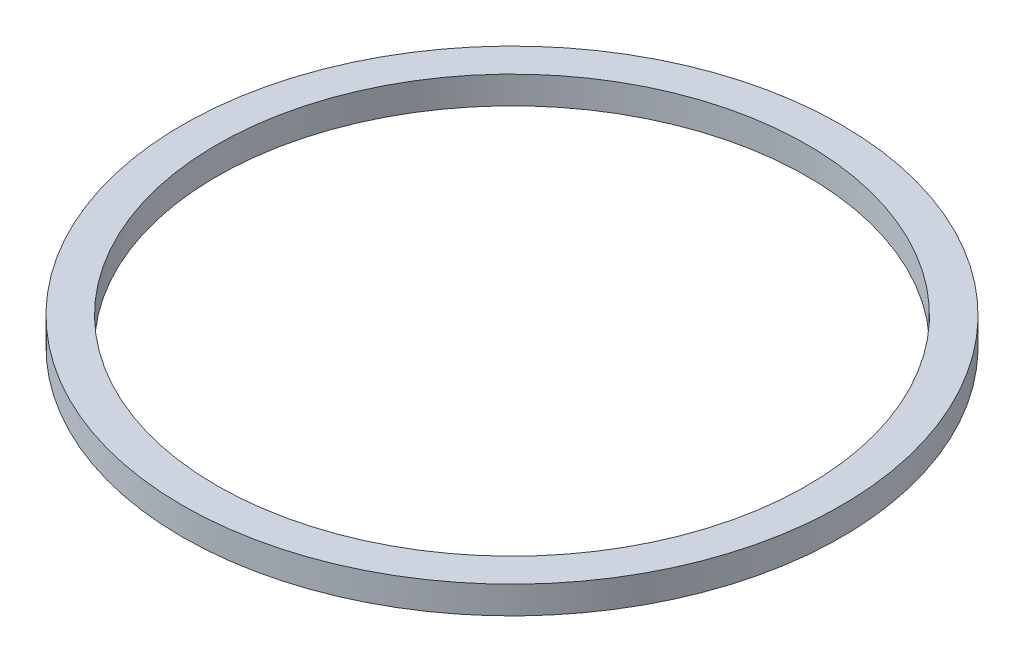
ISO-10303-21;
HEADER;
FILE_DESCRIPTION(('STEP AP214'),'2;1');
FILE_NAME('part.step','',(''),(''),'','','');
FILE_SCHEMA(('AUTOMOTIVE_DESIGN { 1 0 10303 214 1 1 1 1 }'));
ENDSEC;
DATA;
#1=APPLICATION_CONTEXT('core data for automotive mechanical design processes');
#2=APPLICATION_PROTOCOL_DEFINITION('international standard','automotive_design',2000,#1);
#3=PRODUCT_CONTEXT('',#1,'mechanical');
#4=PRODUCT('Part','Part','',(#3));
#5=PRODUCT_RELATED_PRODUCT_CATEGORY('part','',(#4));
#6=PRODUCT_DEFINITION_FORMATION('','',#4);
#7=PRODUCT_DEFINITION_CONTEXT('part definition',#1,'design');
#8=PRODUCT_DEFINITION('design','',#6,#7);
#9=PRODUCT_DEFINITION_SHAPE('','',#8);
#10=(LENGTH_UNIT() NAMED_UNIT(*) SI_UNIT(.MILLI.,.METRE.));
#11=(NAMED_UNIT(*) PLANE_ANGLE_UNIT() SI_UNIT($,.RADIAN.));
#12=(NAMED_UNIT(*) SI_UNIT($,.STERADIAN.) SOLID_ANGLE_UNIT());
#13=UNCERTAINTY_MEASURE_WITH_UNIT(LENGTH_MEASURE(1.E-05),#10,'distance_accuracy_value','');
#14=(GEOMETRIC_REPRESENTATION_CONTEXT(3) GLOBAL_UNCERTAINTY_ASSIGNED_CONTEXT((#13)) GLOBAL_UNIT_ASSIGNED_CONTEXT((#10,
#11,#12)) REPRESENTATION_CONTEXT('',''));
#15=CARTESIAN_POINT('',(0.,0.,0.));
#16=DIRECTION('',(0.,0.,1.));
#17=DIRECTION('',(1.,0.,0.));
#18=AXIS2_PLACEMENT_3D('',#15,#16,#17);
#19=CARTESIAN_POINT('',(0.,0.5,0.));
#20=DIRECTION('',(0.,1.,0.));
#21=DIRECTION('',(0.,0.,1.));
#22=AXIS2_PLACEMENT_3D('',#19,#20,#21);
#23=PLANE('',#22);
#24=CARTESIAN_POINT('',(0.,0.5,0.));
#25=DIRECTION('',(0.,1.,0.));
#26=DIRECTION('',(0.,0.,1.));
#27=AXIS2_PLACEMENT_3D('',#24,#25,#26);
#28=CIRCLE('',#27,12.);
#29=CARTESIAN_POINT('',(0.,0.5,12.));
#30=VERTEX_POINT('',#29);
#31=EDGE_CURVE('E10',#30,#30,#28,.T.);
#32=ORIENTED_EDGE('',*,*,#31,.T.);
#33=EDGE_LOOP('',(#32));
#34=FACE_BOUND('',#33,.T.);
#35=CARTESIAN_POINT('',(0.,0.5,0.));
#36=DIRECTION('',(0.,1.,0.));
#37=DIRECTION('',(0.,0.,1.));
#38=AXIS2_PLACEMENT_3D('',#35,#36,#37);
#39=CIRCLE('',#38,10.75);
#40=CARTESIAN_POINT('',(0.,0.5,10.75));
#41=VERTEX_POINT('',#40);
#42=EDGE_CURVE('E42',#41,#41,#39,.T.);
#43=ORIENTED_EDGE('',*,*,#42,.F.);
#44=EDGE_LOOP('',(#43));
#45=FACE_BOUND('',#44,.T.);
#46=ADVANCED_FACE('F31',(#34,#45),#23,.T.);
#47=CARTESIAN_POINT('',(0.,-0.5,0.));
#48=DIRECTION('',(0.,1.,0.));
#49=DIRECTION('',(0.,0.,1.));
#50=AXIS2_PLACEMENT_3D('',#47,#48,#49);
#51=PLANE('',#50);
#52=CARTESIAN_POINT('',(0.,-0.5,0.));
#53=DIRECTION('',(0.,1.,0.));
#54=DIRECTION('',(0.,0.,1.));
#55=AXIS2_PLACEMENT_3D('',#52,#53,#54);
#56=CIRCLE('',#55,12.);
#57=CARTESIAN_POINT('',(0.,-0.5,12.));
#58=VERTEX_POINT('',#57);
#59=EDGE_CURVE('E35',#58,#58,#56,.T.);
#60=ORIENTED_EDGE('',*,*,#59,.F.);
#61=EDGE_LOOP('',(#60));
#62=FACE_BOUND('',#61,.T.);
#63=CARTESIAN_POINT('',(0.,-0.5,0.));
#64=DIRECTION('',(0.,1.,0.));
#65=DIRECTION('',(0.,0.,1.));
#66=AXIS2_PLACEMENT_3D('',#63,#64,#65);
#67=CIRCLE('',#66,10.75);
#68=CARTESIAN_POINT('',(0.,-0.5,10.75));
#69=VERTEX_POINT('',#68);
#70=EDGE_CURVE('E44',#69,#69,#67,.T.);
#71=ORIENTED_EDGE('',*,*,#70,.T.);
#72=EDGE_LOOP('',(#71));
#73=FACE_BOUND('',#72,.T.);
#74=ADVANCED_FACE('F54',(#62,#73),#51,.F.);
#75=CARTESIAN_POINT('',(0.,0.5,0.));
#76=DIRECTION('',(0.,-1.,0.));
#77=DIRECTION('',(0.,0.,-1.));
#78=AXIS2_PLACEMENT_3D('',#75,#76,#77);
#79=CYLINDRICAL_SURFACE('',#78,12.);
#80=ORIENTED_EDGE('',*,*,#31,.F.);
#81=EDGE_LOOP('',(#80));
#82=FACE_BOUND('',#81,.T.);
#83=ORIENTED_EDGE('',*,*,#59,.T.);
#84=EDGE_LOOP('',(#83));
#85=FACE_BOUND('',#84,.T.);
#86=ADVANCED_FACE('F33',(#82,#85),#79,.T.);
#87=CARTESIAN_POINT('',(0.,0.5,0.));
#88=DIRECTION('',(0.,-1.,0.));
#89=DIRECTION('',(0.,0.,-1.));
#90=AXIS2_PLACEMENT_3D('',#87,#88,#89);
#91=CYLINDRICAL_SURFACE('',#90,10.75);
#92=ORIENTED_EDGE('',*,*,#42,.T.);
#93=EDGE_LOOP('',(#92));
#94=FACE_BOUND('',#93,.T.);
#95=ORIENTED_EDGE('',*,*,#70,.F.);
#96=EDGE_LOOP('',(#95));
#97=FACE_BOUND('',#96,.T.);
#98=ADVANCED_FACE('F50',(#94,#97),#91,.F.);
#99=CLOSED_SHELL('',(#46,#74,#86,#98));
#100=MANIFOLD_SOLID_BREP('B2',#99);
#101=ADVANCED_BREP_SHAPE_REPRESENTATION('',(#18,#100),#14);
#102=SHAPE_DEFINITION_REPRESENTATION(#9,#101);
ENDSEC;
END-ISO-10303-21;
